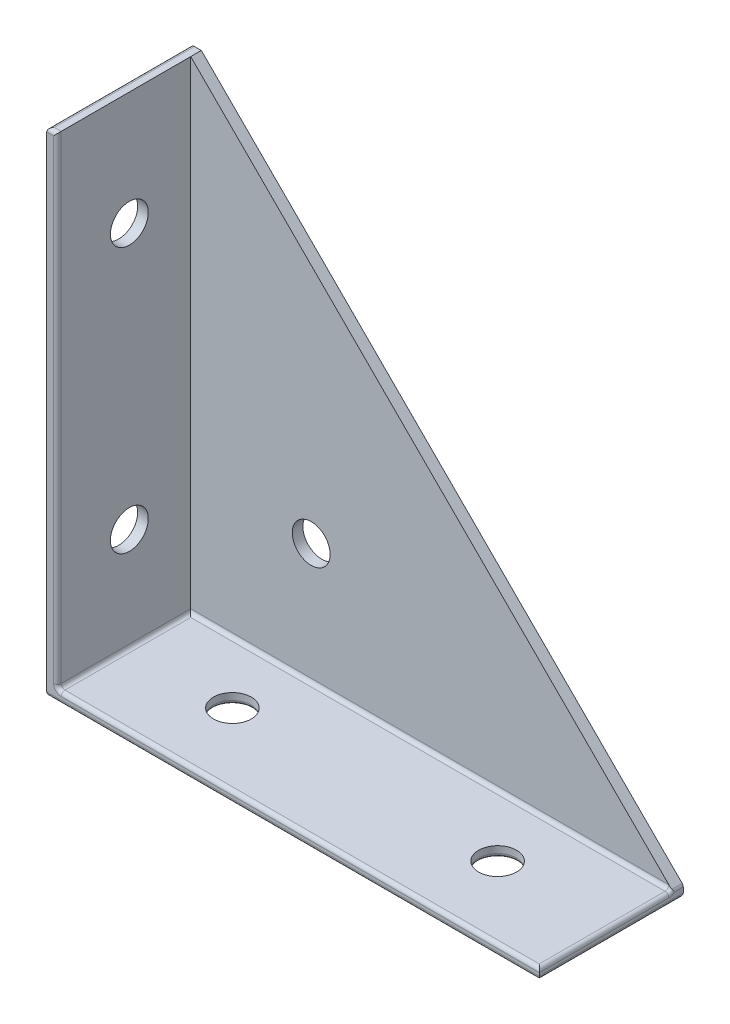
ISO-10303-21;
HEADER;
FILE_DESCRIPTION(('STEP AP214'),'2;1');
FILE_NAME('part.step','',(''),(''),'','','');
FILE_SCHEMA(('AUTOMOTIVE_DESIGN { 1 0 10303 214 1 1 1 1 }'));
ENDSEC;
DATA;
#1=APPLICATION_CONTEXT('core data for automotive mechanical design processes');
#2=APPLICATION_PROTOCOL_DEFINITION('international standard','automotive_design',2000,#1);
#3=PRODUCT_CONTEXT('',#1,'mechanical');
#4=PRODUCT('Part','Part','',(#3));
#5=PRODUCT_RELATED_PRODUCT_CATEGORY('part','',(#4));
#6=PRODUCT_DEFINITION_FORMATION('','',#4);
#7=PRODUCT_DEFINITION_CONTEXT('part definition',#1,'design');
#8=PRODUCT_DEFINITION('design','',#6,#7);
#9=PRODUCT_DEFINITION_SHAPE('','',#8);
#10=(LENGTH_UNIT() NAMED_UNIT(*) SI_UNIT(.MILLI.,.METRE.));
#11=(NAMED_UNIT(*) PLANE_ANGLE_UNIT() SI_UNIT($,.RADIAN.));
#12=(NAMED_UNIT(*) SI_UNIT($,.STERADIAN.) SOLID_ANGLE_UNIT());
#13=UNCERTAINTY_MEASURE_WITH_UNIT(LENGTH_MEASURE(1.E-05),#10,'distance_accuracy_value','');
#14=(GEOMETRIC_REPRESENTATION_CONTEXT(3) GLOBAL_UNCERTAINTY_ASSIGNED_CONTEXT((#13)) GLOBAL_UNIT_ASSIGNED_CONTEXT((#10,
#11,#12)) REPRESENTATION_CONTEXT('',''));
#15=CARTESIAN_POINT('',(0.,0.,0.));
#16=DIRECTION('',(0.,0.,1.));
#17=DIRECTION('',(1.,0.,0.));
#18=AXIS2_PLACEMENT_3D('',#15,#16,#17);
#19=CARTESIAN_POINT('',(0.,0.7,19.));
#20=DIRECTION('',(0.,-1.,0.));
#21=DIRECTION('',(1.,0.,0.));
#22=AXIS2_PLACEMENT_3D('',#19,#20,#21);
#23=PLANE('',#22);
#24=DIRECTION('',(-1.,0.,0.));
#25=VECTOR('',#24,1.);
#26=CARTESIAN_POINT('',(0.,0.7,18.5));
#27=LINE('',#26,#25);
#28=CARTESIAN_POINT('',(-63.1,0.699999999999992,18.5));
#29=VERTEX_POINT('',#28);
#30=CARTESIAN_POINT('',(-0.5,0.7,18.5));
#31=VERTEX_POINT('',#30);
#32=EDGE_CURVE('E297',#29,#31,#27,.F.);
#33=ORIENTED_EDGE('',*,*,#32,.T.);
#34=DIRECTION('',(0.,0.,-1.));
#35=VECTOR('',#34,1.);
#36=CARTESIAN_POINT('',(-0.5,0.7,19.));
#37=LINE('',#36,#35);
#38=CARTESIAN_POINT('',(-0.5,0.7,1.9));
#39=VERTEX_POINT('',#38);
#40=EDGE_CURVE('E299',#31,#39,#37,.T.);
#41=ORIENTED_EDGE('',*,*,#40,.T.);
#42=DIRECTION('',(-1.,0.,0.));
#43=VECTOR('',#42,1.);
#44=CARTESIAN_POINT('',(-63.6,0.699999999999992,1.9));
#45=LINE('',#44,#43);
#46=CARTESIAN_POINT('',(-63.1,0.699999999999992,1.9));
#47=VERTEX_POINT('',#46);
#48=EDGE_CURVE('E287',#39,#47,#45,.T.);
#49=ORIENTED_EDGE('',*,*,#48,.T.);
#50=DIRECTION('',(0.,0.,-1.));
#51=VECTOR('',#50,1.);
#52=CARTESIAN_POINT('',(-63.1,0.699999999999992,19.));
#53=LINE('',#52,#51);
#54=EDGE_CURVE('E290',#47,#29,#53,.F.);
#55=ORIENTED_EDGE('',*,*,#54,.T.);
#56=EDGE_LOOP('',(#33,#41,#49,#55));
#57=FACE_BOUND('',#56,.T.);
#58=CARTESIAN_POINT('',(-15.,0.700000000000006,9.50000000000001));
#59=DIRECTION('',(0.,-1.,0.));
#60=DIRECTION('',(1.,0.,0.));
#61=AXIS2_PLACEMENT_3D('',#58,#59,#60);
#62=CIRCLE('',#61,2.5);
#63=CARTESIAN_POINT('',(-12.5,0.700000000000007,9.50000000000001));
#64=VERTEX_POINT('',#63);
#65=EDGE_CURVE('E173',#64,#64,#62,.T.);
#66=ORIENTED_EDGE('',*,*,#65,.T.);
#67=EDGE_LOOP('',(#66));
#68=FACE_BOUND('',#67,.T.);
#69=CARTESIAN_POINT('',(-50.,0.700000000000006,9.5));
#70=DIRECTION('',(0.,-1.,0.));
#71=DIRECTION('',(1.,0.,0.));
#72=AXIS2_PLACEMENT_3D('',#69,#70,#71);
#73=CIRCLE('',#72,2.5);
#74=CARTESIAN_POINT('',(-47.5,0.700000000000007,9.5));
#75=VERTEX_POINT('',#74);
#76=EDGE_CURVE('E177',#75,#75,#73,.T.);
#77=ORIENTED_EDGE('',*,*,#76,.T.);
#78=EDGE_LOOP('',(#77));
#79=FACE_BOUND('',#78,.T.);
#80=ADVANCED_FACE('F35',(#57,#68,#79),#23,.F.);
#81=CARTESIAN_POINT('',(-63.6,0.699999999999992,19.));
#82=DIRECTION('',(-1.,0.,0.));
#83=DIRECTION('',(0.,0.,1.));
#84=AXIS2_PLACEMENT_3D('',#81,#82,#83);
#85=PLANE('',#84);
#86=CARTESIAN_POINT('',(-63.6,49.3,9.50000000000001));
#87=DIRECTION('',(-1.,0.,0.));
#88=DIRECTION('',(0.,0.,1.));
#89=AXIS2_PLACEMENT_3D('',#86,#87,#88);
#90=CIRCLE('',#89,2.5);
#91=CARTESIAN_POINT('',(-63.6,49.3,12.));
#92=VERTEX_POINT('',#91);
#93=EDGE_CURVE('E433',#92,#92,#90,.F.);
#94=ORIENTED_EDGE('',*,*,#93,.F.);
#95=EDGE_LOOP('',(#94));
#96=FACE_BOUND('',#95,.T.);
#97=CARTESIAN_POINT('',(-63.6,14.3,9.5));
#98=DIRECTION('',(-1.,0.,0.));
#99=DIRECTION('',(0.,0.,1.));
#100=AXIS2_PLACEMENT_3D('',#97,#98,#99);
#101=CIRCLE('',#100,2.5);
#102=CARTESIAN_POINT('',(-63.6,14.3,12.));
#103=VERTEX_POINT('',#102);
#104=EDGE_CURVE('E436',#103,#103,#101,.F.);
#105=ORIENTED_EDGE('',*,*,#104,.F.);
#106=EDGE_LOOP('',(#105));
#107=FACE_BOUND('',#106,.T.);
#108=DIRECTION('',(0.,0.,-1.));
#109=VECTOR('',#108,1.);
#110=CARTESIAN_POINT('',(-63.6,64.3,19.));
#111=LINE('',#110,#109);
#112=CARTESIAN_POINT('',(-63.6,64.3,18.5));
#113=VERTEX_POINT('',#112);
#114=CARTESIAN_POINT('',(-63.6,64.3,1.4));
#115=VERTEX_POINT('',#114);
#116=EDGE_CURVE('E162',#113,#115,#111,.T.);
#117=ORIENTED_EDGE('',*,*,#116,.F.);
#118=DIRECTION('',(0.,1.,0.));
#119=VECTOR('',#118,1.);
#120=CARTESIAN_POINT('',(-63.6,0.699999999999992,18.5));
#121=LINE('',#120,#119);
#122=CARTESIAN_POINT('',(-63.6,1.19999999999999,18.5));
#123=VERTEX_POINT('',#122);
#124=EDGE_CURVE('E206',#113,#123,#121,.F.);
#125=ORIENTED_EDGE('',*,*,#124,.T.);
#126=DIRECTION('',(0.,0.,-1.));
#127=VECTOR('',#126,1.);
#128=CARTESIAN_POINT('',(-63.6,1.19999999999999,1.4));
#129=LINE('',#128,#127);
#130=CARTESIAN_POINT('',(-63.6,1.19999999999999,1.4));
#131=VERTEX_POINT('',#130);
#132=EDGE_CURVE('E204',#123,#131,#129,.T.);
#133=ORIENTED_EDGE('',*,*,#132,.T.);
#134=DIRECTION('',(0.,1.,0.));
#135=VECTOR('',#134,1.);
#136=CARTESIAN_POINT('',(-63.6,64.3,1.4));
#137=LINE('',#136,#135);
#138=EDGE_CURVE('E172',#131,#115,#137,.T.);
#139=ORIENTED_EDGE('',*,*,#138,.T.);
#140=EDGE_LOOP('',(#117,#125,#133,#139));
#141=FACE_BOUND('',#140,.T.);
#142=ADVANCED_FACE('F257',(#96,#107,#141),#85,.F.);
#143=CARTESIAN_POINT('',(0.,0.7,19.));
#144=DIRECTION('',(-1.,0.,0.));
#145=DIRECTION('',(0.,0.,1.));
#146=AXIS2_PLACEMENT_3D('',#143,#144,#145);
#147=PLANE('',#146);
#148=DIRECTION('',(0.,1.,0.));
#149=VECTOR('',#148,1.);
#150=CARTESIAN_POINT('',(0.,0.7,0.));
#151=LINE('',#150,#149);
#152=CARTESIAN_POINT('',(0.,-0.2,0.));
#153=VERTEX_POINT('',#152);
#154=CARTESIAN_POINT('',(0.,0.492893218813452,0.));
#155=VERTEX_POINT('',#154);
#156=EDGE_CURVE('E156',#153,#155,#151,.T.);
#157=ORIENTED_EDGE('',*,*,#156,.T.);
#158=DIRECTION('',(0.,0.,-1.));
#159=VECTOR('',#158,1.);
#160=CARTESIAN_POINT('',(0.,0.492893218813452,1.9));
#161=LINE('',#160,#159);
#162=CARTESIAN_POINT('',(0.,0.492893218813452,1.19289321881345));
#163=VERTEX_POINT('',#162);
#164=EDGE_CURVE('E276',#155,#163,#161,.F.);
#165=ORIENTED_EDGE('',*,*,#164,.T.);
#166=CARTESIAN_POINT('',(0.,1.2,1.9));
#167=DIRECTION('',(-1.,0.,0.));
#168=DIRECTION('',(0.,0.,1.));
#169=AXIS2_PLACEMENT_3D('',#166,#167,#168);
#170=CIRCLE('',#169,1.);
#171=CARTESIAN_POINT('',(0.,0.2,1.9));
#172=VERTEX_POINT('',#171);
#173=EDGE_CURVE('E288',#163,#172,#170,.T.);
#174=ORIENTED_EDGE('',*,*,#173,.T.);
#175=DIRECTION('',(0.,0.,-1.));
#176=VECTOR('',#175,1.);
#177=CARTESIAN_POINT('',(0.,0.2,19.));
#178=LINE('',#177,#176);
#179=CARTESIAN_POINT('',(0.,0.2,19.));
#180=VERTEX_POINT('',#179);
#181=EDGE_CURVE('E292',#172,#180,#178,.F.);
#182=ORIENTED_EDGE('',*,*,#181,.T.);
#183=DIRECTION('',(0.,1.,0.));
#184=VECTOR('',#183,1.);
#185=CARTESIAN_POINT('',(0.,0.7,19.));
#186=LINE('',#185,#184);
#187=CARTESIAN_POINT('',(0.,-0.2,19.));
#188=VERTEX_POINT('',#187);
#189=EDGE_CURVE('E181',#188,#180,#186,.T.);
#190=ORIENTED_EDGE('',*,*,#189,.F.);
#191=DIRECTION('',(0.,0.,-1.));
#192=VECTOR('',#191,1.);
#193=CARTESIAN_POINT('',(0.,-0.2,19.));
#194=LINE('',#193,#192);
#195=EDGE_CURVE('E280',#188,#153,#194,.T.);
#196=ORIENTED_EDGE('',*,*,#195,.T.);
#197=EDGE_LOOP('',(#157,#165,#174,#182,#190,#196));
#198=FACE_BOUND('',#197,.T.);
#199=ADVANCED_FACE('F263',(#198),#147,.F.);
#200=CARTESIAN_POINT('',(-65.,64.3,19.));
#201=DIRECTION('',(0.,-1.,0.));
#202=DIRECTION('',(0.,0.,-1.));
#203=AXIS2_PLACEMENT_3D('',#200,#201,#202);
#204=PLANE('',#203);
#205=DIRECTION('',(0.,0.,-1.));
#206=VECTOR('',#205,1.);
#207=CARTESIAN_POINT('',(-64.5,64.3,19.));
#208=LINE('',#207,#206);
#209=CARTESIAN_POINT('',(-64.5,64.3,0.));
#210=VERTEX_POINT('',#209);
#211=CARTESIAN_POINT('',(-64.5,64.3,18.5));
#212=VERTEX_POINT('',#211);
#213=EDGE_CURVE('E44',#210,#212,#208,.F.);
#214=ORIENTED_EDGE('',*,*,#213,.T.);
#215=DIRECTION('',(-1.,0.,0.));
#216=VECTOR('',#215,1.);
#217=CARTESIAN_POINT('',(-65.,64.3,18.5));
#218=LINE('',#217,#216);
#219=EDGE_CURVE('E11',#212,#113,#218,.F.);
#220=ORIENTED_EDGE('',*,*,#219,.T.);
#221=ORIENTED_EDGE('',*,*,#116,.T.);
#222=DIRECTION('',(0.,0.,-1.));
#223=VECTOR('',#222,1.);
#224=CARTESIAN_POINT('',(-63.6,64.3,1.4));
#225=LINE('',#224,#223);
#226=CARTESIAN_POINT('',(-63.6,64.3,0.));
#227=VERTEX_POINT('',#226);
#228=EDGE_CURVE('E159',#115,#227,#225,.T.);
#229=ORIENTED_EDGE('',*,*,#228,.T.);
#230=DIRECTION('',(-1.,0.,0.));
#231=VECTOR('',#230,1.);
#232=CARTESIAN_POINT('',(-65.,64.3,0.));
#233=LINE('',#232,#231);
#234=EDGE_CURVE('E146',#227,#210,#233,.T.);
#235=ORIENTED_EDGE('',*,*,#234,.T.);
#236=EDGE_LOOP('',(#214,#220,#221,#229,#235));
#237=FACE_BOUND('',#236,.T.);
#238=ADVANCED_FACE('F160',(#237),#204,.F.);
#239=CARTESIAN_POINT('',(-65.,-0.700000000000008,19.));
#240=DIRECTION('',(1.,0.,0.));
#241=DIRECTION('',(0.,0.,-1.));
#242=AXIS2_PLACEMENT_3D('',#239,#240,#241);
#243=PLANE('',#242);
#244=CARTESIAN_POINT('',(-65.,49.3,9.50000000000001));
#245=DIRECTION('',(1.,0.,0.));
#246=DIRECTION('',(0.,1.,0.));
#247=AXIS2_PLACEMENT_3D('',#244,#245,#246);
#248=CIRCLE('',#247,2.5);
#249=CARTESIAN_POINT('',(-65.,51.8,9.50000000000001));
#250=VERTEX_POINT('',#249);
#251=EDGE_CURVE('E441',#250,#250,#248,.T.);
#252=ORIENTED_EDGE('',*,*,#251,.T.);
#253=EDGE_LOOP('',(#252));
#254=FACE_BOUND('',#253,.T.);
#255=CARTESIAN_POINT('',(-65.,14.3,9.5));
#256=DIRECTION('',(1.,0.,0.));
#257=DIRECTION('',(0.,1.,0.));
#258=AXIS2_PLACEMENT_3D('',#255,#256,#257);
#259=CIRCLE('',#258,2.5);
#260=CARTESIAN_POINT('',(-65.,16.8,9.5));
#261=VERTEX_POINT('',#260);
#262=EDGE_CURVE('E489',#261,#261,#259,.T.);
#263=ORIENTED_EDGE('',*,*,#262,.T.);
#264=EDGE_LOOP('',(#263));
#265=FACE_BOUND('',#264,.T.);
#266=DIRECTION('',(0.,-1.,0.));
#267=VECTOR('',#266,1.);
#268=CARTESIAN_POINT('',(-65.,-0.700000000000008,0.));
#269=LINE('',#268,#267);
#270=CARTESIAN_POINT('',(-65.,63.8,0.));
#271=VERTEX_POINT('',#270);
#272=CARTESIAN_POINT('',(-65.,-0.200000000000008,0.));
#273=VERTEX_POINT('',#272);
#274=EDGE_CURVE('E155',#271,#273,#269,.T.);
#275=ORIENTED_EDGE('',*,*,#274,.T.);
#276=DIRECTION('',(0.,0.,-1.));
#277=VECTOR('',#276,1.);
#278=CARTESIAN_POINT('',(-65.,-0.200000000000008,19.));
#279=LINE('',#278,#277);
#280=CARTESIAN_POINT('',(-65.,-0.200000000000008,19.));
#281=VERTEX_POINT('',#280);
#282=EDGE_CURVE('E319',#273,#281,#279,.F.);
#283=ORIENTED_EDGE('',*,*,#282,.T.);
#284=DIRECTION('',(0.,-1.,0.));
#285=VECTOR('',#284,1.);
#286=CARTESIAN_POINT('',(-65.,-0.700000000000008,19.));
#287=LINE('',#286,#285);
#288=CARTESIAN_POINT('',(-65.,63.8,19.));
#289=VERTEX_POINT('',#288);
#290=EDGE_CURVE('E184',#289,#281,#287,.T.);
#291=ORIENTED_EDGE('',*,*,#290,.F.);
#292=DIRECTION('',(0.,0.,-1.));
#293=VECTOR('',#292,1.);
#294=CARTESIAN_POINT('',(-65.,63.8,19.));
#295=LINE('',#294,#293);
#296=EDGE_CURVE('E317',#289,#271,#295,.T.);
#297=ORIENTED_EDGE('',*,*,#296,.T.);
#298=EDGE_LOOP('',(#275,#283,#291,#297));
#299=FACE_BOUND('',#298,.T.);
#300=ADVANCED_FACE('F273',(#254,#265,#299),#243,.F.);
#301=CARTESIAN_POINT('',(0.,-0.7,19.));
#302=DIRECTION('',(0.,1.,0.));
#303=DIRECTION('',(-1.,0.,0.));
#304=AXIS2_PLACEMENT_3D('',#301,#302,#303);
#305=PLANE('',#304);
#306=DIRECTION('',(1.,0.,0.));
#307=VECTOR('',#306,1.);
#308=CARTESIAN_POINT('',(0.,-0.7,18.5));
#309=LINE('',#308,#307);
#310=CARTESIAN_POINT('',(-0.5,-0.7,18.5));
#311=VERTEX_POINT('',#310);
#312=CARTESIAN_POINT('',(-64.5,-0.700000000000008,18.5));
#313=VERTEX_POINT('',#312);
#314=EDGE_CURVE('E58',#311,#313,#309,.F.);
#315=ORIENTED_EDGE('',*,*,#314,.T.);
#316=DIRECTION('',(0.,0.,-1.));
#317=VECTOR('',#316,1.);
#318=CARTESIAN_POINT('',(-64.5,-0.700000000000008,19.));
#319=LINE('',#318,#317);
#320=CARTESIAN_POINT('',(-64.5,-0.700000000000008,0.5));
#321=VERTEX_POINT('',#320);
#322=EDGE_CURVE('E315',#313,#321,#319,.T.);
#323=ORIENTED_EDGE('',*,*,#322,.T.);
#324=DIRECTION('',(1.,0.,0.));
#325=VECTOR('',#324,1.);
#326=CARTESIAN_POINT('',(0.,-0.7,0.5));
#327=LINE('',#326,#325);
#328=CARTESIAN_POINT('',(-0.5,-0.7,0.5));
#329=VERTEX_POINT('',#328);
#330=EDGE_CURVE('E310',#321,#329,#327,.T.);
#331=ORIENTED_EDGE('',*,*,#330,.T.);
#332=DIRECTION('',(0.,0.,-1.));
#333=VECTOR('',#332,1.);
#334=CARTESIAN_POINT('',(-0.5,-0.7,19.));
#335=LINE('',#334,#333);
#336=EDGE_CURVE('E312',#329,#311,#335,.F.);
#337=ORIENTED_EDGE('',*,*,#336,.T.);
#338=EDGE_LOOP('',(#315,#323,#331,#337));
#339=FACE_BOUND('',#338,.T.);
#340=CARTESIAN_POINT('',(-50.,-0.700000000000006,9.5));
#341=DIRECTION('',(0.,1.,0.));
#342=DIRECTION('',(-1.,0.,0.));
#343=AXIS2_PLACEMENT_3D('',#340,#341,#342);
#344=CIRCLE('',#343,3.);
#345=CARTESIAN_POINT('',(-53.,-0.700000000000006,9.5));
#346=VERTEX_POINT('',#345);
#347=EDGE_CURVE('E307',#346,#346,#344,.T.);
#348=ORIENTED_EDGE('',*,*,#347,.T.);
#349=EDGE_LOOP('',(#348));
#350=FACE_BOUND('',#349,.T.);
#351=CARTESIAN_POINT('',(-15.,-0.700000000000002,9.50000000000001));
#352=DIRECTION('',(0.,1.,0.));
#353=DIRECTION('',(-1.,0.,0.));
#354=AXIS2_PLACEMENT_3D('',#351,#352,#353);
#355=CIRCLE('',#354,3.);
#356=CARTESIAN_POINT('',(-18.,-0.700000000000002,9.50000000000001));
#357=VERTEX_POINT('',#356);
#358=EDGE_CURVE('E304',#357,#357,#355,.T.);
#359=ORIENTED_EDGE('',*,*,#358,.T.);
#360=EDGE_LOOP('',(#359));
#361=FACE_BOUND('',#360,.T.);
#362=ADVANCED_FACE('F473',(#339,#350,#361),#305,.F.);
#363=CARTESIAN_POINT('',(0.,0.,19.));
#364=DIRECTION('',(0.,0.,-1.));
#365=DIRECTION('',(-1.,0.,0.));
#366=AXIS2_PLACEMENT_3D('',#363,#364,#365);
#367=PLANE('',#366);
#368=ORIENTED_EDGE('',*,*,#290,.T.);
#369=DIRECTION('',(1.,0.,0.));
#370=VECTOR('',#369,1.);
#371=CARTESIAN_POINT('',(0.,-0.2,19.));
#372=LINE('',#371,#370);
#373=EDGE_CURVE('E202',#281,#188,#372,.T.);
#374=ORIENTED_EDGE('',*,*,#373,.T.);
#375=ORIENTED_EDGE('',*,*,#189,.T.);
#376=DIRECTION('',(-1.,0.,0.));
#377=VECTOR('',#376,1.);
#378=CARTESIAN_POINT('',(0.,0.2,19.));
#379=LINE('',#378,#377);
#380=CARTESIAN_POINT('',(-63.1,0.199999999999992,19.));
#381=VERTEX_POINT('',#380);
#382=EDGE_CURVE('E200',#180,#381,#379,.T.);
#383=ORIENTED_EDGE('',*,*,#382,.T.);
#384=CARTESIAN_POINT('',(-63.1,1.19999999999999,19.));
#385=DIRECTION('',(0.,0.,-1.));
#386=DIRECTION('',(-1.,0.,0.));
#387=AXIS2_PLACEMENT_3D('',#384,#385,#386);
#388=CIRCLE('',#387,1.);
#389=CARTESIAN_POINT('',(-64.1,1.19999999999999,19.));
#390=VERTEX_POINT('',#389);
#391=EDGE_CURVE('E197',#390,#381,#388,.F.);
#392=ORIENTED_EDGE('',*,*,#391,.F.);
#393=DIRECTION('',(0.,1.,0.));
#394=VECTOR('',#393,1.);
#395=CARTESIAN_POINT('',(-64.1,0.,19.));
#396=LINE('',#395,#394);
#397=CARTESIAN_POINT('',(-64.1,63.8,19.));
#398=VERTEX_POINT('',#397);
#399=EDGE_CURVE('E194',#390,#398,#396,.T.);
#400=ORIENTED_EDGE('',*,*,#399,.T.);
#401=DIRECTION('',(-1.,0.,0.));
#402=VECTOR('',#401,1.);
#403=CARTESIAN_POINT('',(0.,63.8,19.));
#404=LINE('',#403,#402);
#405=EDGE_CURVE('E192',#398,#289,#404,.T.);
#406=ORIENTED_EDGE('',*,*,#405,.T.);
#407=EDGE_LOOP('',(#368,#374,#375,#383,#392,#400,#406));
#408=FACE_BOUND('',#407,.T.);
#409=ADVANCED_FACE('F420',(#408),#367,.F.);
#410=CARTESIAN_POINT('',(0.,0.,0.));
#411=DIRECTION('',(0.,0.,-1.));
#412=DIRECTION('',(-1.,0.,0.));
#413=AXIS2_PLACEMENT_3D('',#410,#411,#412);
#414=PLANE('',#413);
#415=CARTESIAN_POINT('',(-47.7,16.6,0.));
#416=DIRECTION('',(0.,0.,1.));
#417=DIRECTION('',(1.,0.,0.));
#418=AXIS2_PLACEMENT_3D('',#415,#416,#417);
#419=CIRCLE('',#418,2.5);
#420=CARTESIAN_POINT('',(-45.2,16.6,0.));
#421=VERTEX_POINT('',#420);
#422=EDGE_CURVE('E445',#421,#421,#419,.T.);
#423=ORIENTED_EDGE('',*,*,#422,.T.);
#424=EDGE_LOOP('',(#423));
#425=FACE_BOUND('',#424,.T.);
#426=DIRECTION('',(0.707106781186548,-0.707106781186547,0.));
#427=VECTOR('',#426,1.);
#428=CARTESIAN_POINT('',(0.,0.7,0.));
#429=LINE('',#428,#427);
#430=CARTESIAN_POINT('',(-0.146446609406726,0.846446609406726,0.));
#431=VERTEX_POINT('',#430);
#432=EDGE_CURVE('E150',#227,#431,#429,.T.);
#433=ORIENTED_EDGE('',*,*,#432,.T.);
#434=CARTESIAN_POINT('',(-0.5,0.492893218813452,0.));
#435=DIRECTION('',(0.,0.,-1.));
#436=DIRECTION('',(-1.,0.,0.));
#437=AXIS2_PLACEMENT_3D('',#434,#435,#436);
#438=CIRCLE('',#437,0.5);
#439=EDGE_CURVE('E283',#431,#155,#438,.T.);
#440=ORIENTED_EDGE('',*,*,#439,.T.);
#441=ORIENTED_EDGE('',*,*,#156,.F.);
#442=DIRECTION('',(1.,0.,0.));
#443=VECTOR('',#442,1.);
#444=CARTESIAN_POINT('',(-65.,-0.200000000000008,0.));
#445=LINE('',#444,#443);
#446=EDGE_CURVE('E492',#153,#273,#445,.F.);
#447=ORIENTED_EDGE('',*,*,#446,.T.);
#448=ORIENTED_EDGE('',*,*,#274,.F.);
#449=CARTESIAN_POINT('',(-64.5,63.8,0.));
#450=DIRECTION('',(0.,0.,-1.));
#451=DIRECTION('',(-1.,0.,0.));
#452=AXIS2_PLACEMENT_3D('',#449,#450,#451);
#453=CIRCLE('',#452,0.5);
#454=EDGE_CURVE('E154',#271,#210,#453,.T.);
#455=ORIENTED_EDGE('',*,*,#454,.T.);
#456=ORIENTED_EDGE('',*,*,#234,.F.);
#457=EDGE_LOOP('',(#433,#440,#441,#447,#448,#455,#456));
#458=FACE_BOUND('',#457,.T.);
#459=ADVANCED_FACE('F148',(#425,#458),#414,.T.);
#460=CARTESIAN_POINT('',(0.,0.7,1.4));
#461=DIRECTION('',(0.707106781186547,0.707106781186548,0.));
#462=DIRECTION('',(-0.707106781186548,0.707106781186547,0.));
#463=AXIS2_PLACEMENT_3D('',#460,#461,#462);
#464=PLANE('',#463);
#465=CARTESIAN_POINT('',(-0.5,1.2,1.4));
#466=CARTESIAN_POINT('',(-0.485162219203026,1.18516221920303,1.39999377626002));
#467=CARTESIAN_POINT('',(-0.470325305604055,1.17032530560406,1.40000226844239));
#468=CARTESIAN_POINT('',(-0.440660384887088,1.14066038488709,1.39998197331207));
#469=CARTESIAN_POINT('',(-0.425832377753319,1.12583237775332,1.3999532083087));
#470=CARTESIAN_POINT('',(-0.381507333883705,1.0815073338837,1.39971203403552));
#471=CARTESIAN_POINT('',(-0.352007815647787,1.05200781564779,1.39934612237822));
#472=CARTESIAN_POINT('',(-0.307669988459025,1.00766998845903,1.39714807314896));
#473=CARTESIAN_POINT('',(-0.29281604580657,0.99281604580657,1.3961330750389));
#474=CARTESIAN_POINT('',(-0.263181929372075,0.963181929372075,1.39311409571184));
#475=CARTESIAN_POINT('',(-0.248401672146648,0.948401672146648,1.3911118409812));
#476=CARTESIAN_POINT('',(-0.218879854060639,0.918879854060639,1.38553486882269));
#477=CARTESIAN_POINT('',(-0.204139021061337,0.904139021061337,1.38195105274939));
#478=CARTESIAN_POINT('',(-0.174965433460443,0.874965433460443,1.37238920837349));
#479=CARTESIAN_POINT('',(-0.16053519863333,0.86053519863333,1.36639626819988));
#480=CARTESIAN_POINT('',(-0.146446609406726,0.846446609406726,1.3588038998538));
#481=B_SPLINE_CURVE_WITH_KNOTS('',3,(#465,#466,#467,#468,#469,#470,#471,#472,#473,#474,#475,
#476,#477,#478,#479,#480),.UNSPECIFIED.,.F.,.F.,(4,2,2,2,2,2,2,4),(0.,0.0629489015635165,
0.125860127208308,0.250997435552492,0.314075444483414,0.37704353353592,0.440378695750531,
0.504112076163589),.UNSPECIFIED.);
#482=CARTESIAN_POINT('',(-0.5,1.2,1.4));
#483=VERTEX_POINT('',#482);
#484=CARTESIAN_POINT('',(-0.146446609406726,0.846446609406726,1.3588038998538));
#485=VERTEX_POINT('',#484);
#486=EDGE_CURVE('E208',#483,#485,#481,.T.);
#487=ORIENTED_EDGE('',*,*,#486,.T.);
#488=DIRECTION('',(0.,0.,-1.));
#489=VECTOR('',#488,1.);
#490=CARTESIAN_POINT('',(-0.146446609406726,0.846446609406726,0.));
#491=LINE('',#490,#489);
#492=EDGE_CURVE('E171',#485,#431,#491,.T.);
#493=ORIENTED_EDGE('',*,*,#492,.T.);
#494=ORIENTED_EDGE('',*,*,#432,.F.);
#495=ORIENTED_EDGE('',*,*,#228,.F.);
#496=DIRECTION('',(0.707106781186548,-0.707106781186547,0.));
#497=VECTOR('',#496,1.);
#498=CARTESIAN_POINT('',(0.,0.7,1.4));
#499=LINE('',#498,#497);
#500=EDGE_CURVE('E167',#115,#483,#499,.T.);
#501=ORIENTED_EDGE('',*,*,#500,.T.);
#502=EDGE_LOOP('',(#487,#493,#494,#495,#501));
#503=FACE_BOUND('',#502,.T.);
#504=ADVANCED_FACE('F169',(#503),#464,.T.);
#505=CARTESIAN_POINT('',(0.,0.,1.4));
#506=DIRECTION('',(0.,0.,-1.));
#507=DIRECTION('',(-1.,0.,0.));
#508=AXIS2_PLACEMENT_3D('',#505,#506,#507);
#509=PLANE('',#508);
#510=CARTESIAN_POINT('',(-47.7,16.6,1.4));
#511=DIRECTION('',(0.,0.,1.));
#512=DIRECTION('',(1.,0.,0.));
#513=AXIS2_PLACEMENT_3D('',#510,#511,#512);
#514=CIRCLE('',#513,2.5);
#515=CARTESIAN_POINT('',(-45.2,16.6,1.4));
#516=VERTEX_POINT('',#515);
#517=EDGE_CURVE('E360',#516,#516,#514,.T.);
#518=ORIENTED_EDGE('',*,*,#517,.F.);
#519=EDGE_LOOP('',(#518));
#520=FACE_BOUND('',#519,.T.);
#521=ORIENTED_EDGE('',*,*,#138,.F.);
#522=DIRECTION('',(-1.,0.,0.));
#523=VECTOR('',#522,1.);
#524=CARTESIAN_POINT('',(0.,1.2,1.4));
#525=LINE('',#524,#523);
#526=EDGE_CURVE('E302',#131,#483,#525,.F.);
#527=ORIENTED_EDGE('',*,*,#526,.T.);
#528=ORIENTED_EDGE('',*,*,#500,.F.);
#529=EDGE_LOOP('',(#521,#527,#528));
#530=FACE_BOUND('',#529,.T.);
#531=ADVANCED_FACE('F410',(#520,#530),#509,.F.);
#532=CARTESIAN_POINT('',(-50.,64.3,9.5));
#533=DIRECTION('',(0.,-1.,0.));
#534=DIRECTION('',(1.,0.,0.));
#535=AXIS2_PLACEMENT_3D('',#532,#533,#534);
#536=CYLINDRICAL_SURFACE('',#535,2.5);
#537=CARTESIAN_POINT('',(-50.,-0.200000000000006,9.5));
#538=DIRECTION('',(0.,1.,0.));
#539=DIRECTION('',(-1.,0.,0.));
#540=AXIS2_PLACEMENT_3D('',#537,#538,#539);
#541=CIRCLE('',#540,2.5);
#542=CARTESIAN_POINT('',(-52.5,-0.200000000000006,9.5));
#543=VERTEX_POINT('',#542);
#544=EDGE_CURVE('E322',#543,#543,#541,.F.);
#545=ORIENTED_EDGE('',*,*,#544,.T.);
#546=EDGE_LOOP('',(#545));
#547=FACE_BOUND('',#546,.T.);
#548=ORIENTED_EDGE('',*,*,#76,.F.);
#549=EDGE_LOOP('',(#548));
#550=FACE_BOUND('',#549,.T.);
#551=ADVANCED_FACE('F454',(#547,#550),#536,.F.);
#552=CARTESIAN_POINT('',(-15.,64.3,9.50000000000001));
#553=DIRECTION('',(0.,-1.,0.));
#554=DIRECTION('',(1.,0.,0.));
#555=AXIS2_PLACEMENT_3D('',#552,#553,#554);
#556=CYLINDRICAL_SURFACE('',#555,2.5);
#557=CARTESIAN_POINT('',(-15.,-0.200000000000006,9.50000000000001));
#558=DIRECTION('',(0.,1.,0.));
#559=DIRECTION('',(-1.,0.,0.));
#560=AXIS2_PLACEMENT_3D('',#557,#558,#559);
#561=CIRCLE('',#560,2.5);
#562=CARTESIAN_POINT('',(-17.5,-0.200000000000006,9.50000000000001));
#563=VERTEX_POINT('',#562);
#564=EDGE_CURVE('E325',#563,#563,#561,.F.);
#565=ORIENTED_EDGE('',*,*,#564,.T.);
#566=EDGE_LOOP('',(#565));
#567=FACE_BOUND('',#566,.T.);
#568=ORIENTED_EDGE('',*,*,#65,.F.);
#569=EDGE_LOOP('',(#568));
#570=FACE_BOUND('',#569,.T.);
#571=ADVANCED_FACE('F456',(#567,#570),#556,.F.);
#572=CARTESIAN_POINT('',(-47.7,16.6,0.));
#573=DIRECTION('',(0.,0.,1.));
#574=DIRECTION('',(1.,0.,0.));
#575=AXIS2_PLACEMENT_3D('',#572,#573,#574);
#576=CYLINDRICAL_SURFACE('',#575,2.5);
#577=ORIENTED_EDGE('',*,*,#422,.F.);
#578=EDGE_LOOP('',(#577));
#579=FACE_BOUND('',#578,.T.);
#580=ORIENTED_EDGE('',*,*,#517,.T.);
#581=EDGE_LOOP('',(#580));
#582=FACE_BOUND('',#581,.T.);
#583=ADVANCED_FACE('F366',(#579,#582),#576,.F.);
#584=CARTESIAN_POINT('',(-0.5,0.492893218813452,1.4));
#585=DIRECTION('',(0.,0.,1.));
#586=DIRECTION('',(1.,0.,0.));
#587=AXIS2_PLACEMENT_3D('',#584,#585,#586);
#588=CYLINDRICAL_SURFACE('',#587,0.5);
#589=ORIENTED_EDGE('',*,*,#439,.F.);
#590=ORIENTED_EDGE('',*,*,#492,.F.);
#591=CARTESIAN_POINT('',(-0.146446609406726,0.846446609406726,1.3588038998538));
#592=CARTESIAN_POINT('',(-0.124784367461786,0.824794291418535,1.34706290394334));
#593=CARTESIAN_POINT('',(-0.105297161182896,0.801320312395509,1.3347620776401));
#594=CARTESIAN_POINT('',(-0.070963407803651,0.751434681820469,1.30948924996582));
#595=CARTESIAN_POINT('',(-0.0561252167792954,0.725017855010009,1.29651608835444));
#596=CARTESIAN_POINT('',(-0.0314661332416588,0.670048993151626,1.27039909285965));
#597=CARTESIAN_POINT('',(-0.0216426787216906,0.641498056975649,1.25725534965243));
#598=CARTESIAN_POINT('',(-0.00728788428837452,0.583085718852994,1.23116868064712));
#599=CARTESIAN_POINT('',(-0.0027406913979687,0.553228523684172,1.21822526917668));
#600=CARTESIAN_POINT('',(-0.000404717374361598,0.514715333506909,1.20198158201772));
#601=CARTESIAN_POINT('',(-0.000107205311346626,0.506266195640993,1.19844553389375));
#602=CARTESIAN_POINT('',(-8.05845428243942E-06,0.49616858215308,1.1942508985504));
#603=CARTESIAN_POINT('',(-1.29580232952005E-08,0.494531091576207,1.19357165196697));
#604=CARTESIAN_POINT('',(0.,0.492893218813452,1.19289321881345));
#605=B_SPLINE_CURVE_WITH_KNOTS('',3,(#591,#592,#593,#594,#595,#596,#597,#598,#599,#600,#601,
#602,#603,#604),.UNSPECIFIED.,.F.,.F.,(4,2,2,2,2,2,4),(0.,0.0982345772058892,0.196644720210536,
0.29500453546418,0.393068048706641,0.420553961059924,0.425872312400684),.UNSPECIFIED.);
#606=EDGE_CURVE('E285',#163,#485,#605,.F.);
#607=ORIENTED_EDGE('',*,*,#606,.F.);
#608=ORIENTED_EDGE('',*,*,#164,.F.);
#609=EDGE_LOOP('',(#589,#590,#607,#608));
#610=FACE_BOUND('',#609,.T.);
#611=ADVANCED_FACE('F226',(#610),#588,.T.);
#612=CARTESIAN_POINT('',(-0.5,1.2,1.9));
#613=DIRECTION('',(-1.,0.,0.));
#614=DIRECTION('',(0.,0.,1.));
#615=AXIS2_PLACEMENT_3D('',#612,#613,#614);
#616=TOROIDAL_SURFACE('',#615,1.,0.5);
#617=ORIENTED_EDGE('',*,*,#606,.T.);
#618=ORIENTED_EDGE('',*,*,#486,.F.);
#619=CARTESIAN_POINT('',(-0.5,1.2,1.9));
#620=DIRECTION('',(-1.,0.,0.));
#621=DIRECTION('',(0.,0.,1.));
#622=AXIS2_PLACEMENT_3D('',#619,#620,#621);
#623=CIRCLE('',#622,0.5);
#624=EDGE_CURVE('E352',#39,#483,#623,.F.);
#625=ORIENTED_EDGE('',*,*,#624,.F.);
#626=CARTESIAN_POINT('',(-0.5,0.2,1.9));
#627=DIRECTION('',(0.,0.,1.));
#628=DIRECTION('',(1.,0.,0.));
#629=AXIS2_PLACEMENT_3D('',#626,#627,#628);
#630=CIRCLE('',#629,0.5);
#631=EDGE_CURVE('E349',#172,#39,#630,.T.);
#632=ORIENTED_EDGE('',*,*,#631,.F.);
#633=ORIENTED_EDGE('',*,*,#173,.F.);
#634=EDGE_LOOP('',(#617,#618,#625,#632,#633));
#635=FACE_BOUND('',#634,.T.);
#636=ADVANCED_FACE('F220',(#635),#616,.T.);
#637=CARTESIAN_POINT('',(0.,1.2,1.9));
#638=DIRECTION('',(1.,0.,0.));
#639=DIRECTION('',(0.,1.,0.));
#640=AXIS2_PLACEMENT_3D('',#637,#638,#639);
#641=CYLINDRICAL_SURFACE('',#640,0.5);
#642=ORIENTED_EDGE('',*,*,#624,.T.);
#643=ORIENTED_EDGE('',*,*,#526,.F.);
#644=CARTESIAN_POINT('',(-63.1,1.19999999999999,1.9));
#645=DIRECTION('',(-0.707106781186547,0.,0.707106781186547));
#646=DIRECTION('',(0.707106781186547,0.,0.707106781186547));
#647=AXIS2_PLACEMENT_3D('',#644,#645,#646);
#648=ELLIPSE('',#647,0.707106781186547,0.5);
#649=EDGE_CURVE('E346',#47,#131,#648,.F.);
#650=ORIENTED_EDGE('',*,*,#649,.F.);
#651=ORIENTED_EDGE('',*,*,#48,.F.);
#652=EDGE_LOOP('',(#642,#643,#650,#651));
#653=FACE_BOUND('',#652,.T.);
#654=ADVANCED_FACE('F225',(#653),#641,.F.);
#655=CARTESIAN_POINT('',(-0.5,0.2,19.));
#656=DIRECTION('',(0.,0.,-1.));
#657=DIRECTION('',(-1.,0.,0.));
#658=AXIS2_PLACEMENT_3D('',#655,#656,#657);
#659=CYLINDRICAL_SURFACE('',#658,0.5);
#660=ORIENTED_EDGE('',*,*,#631,.T.);
#661=ORIENTED_EDGE('',*,*,#40,.F.);
#662=CARTESIAN_POINT('',(-0.5,0.2,18.5));
#663=DIRECTION('',(-0.707106781186547,0.,0.707106781186547));
#664=DIRECTION('',(-0.707106781186547,0.,-0.707106781186547));
#665=AXIS2_PLACEMENT_3D('',#662,#663,#664);
#666=ELLIPSE('',#665,0.707106781186547,0.5);
#667=EDGE_CURVE('E343',#180,#31,#666,.T.);
#668=ORIENTED_EDGE('',*,*,#667,.F.);
#669=ORIENTED_EDGE('',*,*,#181,.F.);
#670=EDGE_LOOP('',(#660,#661,#668,#669));
#671=FACE_BOUND('',#670,.T.);
#672=ADVANCED_FACE('F369',(#671),#659,.T.);
#673=CARTESIAN_POINT('',(-63.1,1.19999999999999,19.));
#674=DIRECTION('',(0.,0.,1.));
#675=DIRECTION('',(1.,0.,0.));
#676=AXIS2_PLACEMENT_3D('',#673,#674,#675);
#677=CYLINDRICAL_SURFACE('',#676,0.5);
#678=ORIENTED_EDGE('',*,*,#649,.T.);
#679=ORIENTED_EDGE('',*,*,#132,.F.);
#680=CARTESIAN_POINT('',(-63.1,1.19999999999999,18.5));
#681=DIRECTION('',(0.,0.,-1.));
#682=DIRECTION('',(-1.,0.,0.));
#683=AXIS2_PLACEMENT_3D('',#680,#681,#682);
#684=CIRCLE('',#683,0.5);
#685=EDGE_CURVE('E340',#29,#123,#684,.T.);
#686=ORIENTED_EDGE('',*,*,#685,.F.);
#687=ORIENTED_EDGE('',*,*,#54,.F.);
#688=EDGE_LOOP('',(#678,#679,#686,#687));
#689=FACE_BOUND('',#688,.T.);
#690=ADVANCED_FACE('F373',(#689),#677,.F.);
#691=CARTESIAN_POINT('',(0.,0.2,18.5));
#692=DIRECTION('',(-1.,0.,0.));
#693=DIRECTION('',(0.,-1.,0.));
#694=AXIS2_PLACEMENT_3D('',#691,#692,#693);
#695=CYLINDRICAL_SURFACE('',#694,0.5);
#696=ORIENTED_EDGE('',*,*,#667,.T.);
#697=ORIENTED_EDGE('',*,*,#32,.F.);
#698=CARTESIAN_POINT('',(-63.1,0.199999999999992,18.5));
#699=DIRECTION('',(-1.,0.,0.));
#700=DIRECTION('',(0.,0.,1.));
#701=AXIS2_PLACEMENT_3D('',#698,#699,#700);
#702=CIRCLE('',#701,0.5);
#703=EDGE_CURVE('E337',#381,#29,#702,.T.);
#704=ORIENTED_EDGE('',*,*,#703,.F.);
#705=ORIENTED_EDGE('',*,*,#382,.F.);
#706=EDGE_LOOP('',(#696,#697,#704,#705));
#707=FACE_BOUND('',#706,.T.);
#708=ADVANCED_FACE('F377',(#707),#695,.T.);
#709=CARTESIAN_POINT('',(-64.5,63.8,19.));
#710=DIRECTION('',(0.,0.,-1.));
#711=DIRECTION('',(-1.,0.,0.));
#712=AXIS2_PLACEMENT_3D('',#709,#710,#711);
#713=CYLINDRICAL_SURFACE('',#712,0.5);
#714=ORIENTED_EDGE('',*,*,#454,.F.);
#715=ORIENTED_EDGE('',*,*,#296,.F.);
#716=CARTESIAN_POINT('',(-64.5,63.8,18.5));
#717=DIRECTION('',(-0.707106781186547,0.,-0.707106781186547));
#718=DIRECTION('',(0.707106781186547,0.,-0.707106781186547));
#719=AXIS2_PLACEMENT_3D('',#716,#717,#718);
#720=ELLIPSE('',#719,0.707106781186547,0.5);
#721=EDGE_CURVE('E334',#212,#289,#720,.F.);
#722=ORIENTED_EDGE('',*,*,#721,.F.);
#723=ORIENTED_EDGE('',*,*,#213,.F.);
#724=EDGE_LOOP('',(#714,#715,#722,#723));
#725=FACE_BOUND('',#724,.T.);
#726=ADVANCED_FACE('F381',(#725),#713,.T.);
#727=CARTESIAN_POINT('',(-63.1,1.19999999999999,18.5));
#728=DIRECTION('',(0.,0.,-1.));
#729=DIRECTION('',(-1.,0.,0.));
#730=AXIS2_PLACEMENT_3D('',#727,#728,#729);
#731=TOROIDAL_SURFACE('',#730,1.,0.5);
#732=ORIENTED_EDGE('',*,*,#703,.T.);
#733=ORIENTED_EDGE('',*,*,#685,.T.);
#734=CARTESIAN_POINT('',(-64.1,1.19999999999999,18.5));
#735=DIRECTION('',(0.,-1.,0.));
#736=DIRECTION('',(0.,0.,-1.));
#737=AXIS2_PLACEMENT_3D('',#734,#735,#736);
#738=CIRCLE('',#737,0.5);
#739=EDGE_CURVE('E331',#390,#123,#738,.F.);
#740=ORIENTED_EDGE('',*,*,#739,.F.);
#741=ORIENTED_EDGE('',*,*,#391,.T.);
#742=EDGE_LOOP('',(#732,#733,#740,#741));
#743=FACE_BOUND('',#742,.T.);
#744=ADVANCED_FACE('F385',(#743),#731,.T.);
#745=CARTESIAN_POINT('',(0.,63.8,18.5));
#746=DIRECTION('',(-1.,0.,0.));
#747=DIRECTION('',(0.,0.,1.));
#748=AXIS2_PLACEMENT_3D('',#745,#746,#747);
#749=CYLINDRICAL_SURFACE('',#748,0.5);
#750=ORIENTED_EDGE('',*,*,#721,.T.);
#751=ORIENTED_EDGE('',*,*,#405,.F.);
#752=CARTESIAN_POINT('',(-64.1,63.8,18.5));
#753=DIRECTION('',(-0.707106781186547,0.707106781186547,0.));
#754=DIRECTION('',(-0.707106781186547,-0.707106781186547,0.));
#755=AXIS2_PLACEMENT_3D('',#752,#753,#754);
#756=ELLIPSE('',#755,0.707106781186547,0.5);
#757=EDGE_CURVE('E329',#113,#398,#756,.F.);
#758=ORIENTED_EDGE('',*,*,#757,.F.);
#759=ORIENTED_EDGE('',*,*,#219,.F.);
#760=EDGE_LOOP('',(#750,#751,#758,#759));
#761=FACE_BOUND('',#760,.T.);
#762=ADVANCED_FACE('F389',(#761),#749,.T.);
#763=CARTESIAN_POINT('',(-64.1,0.,18.5));
#764=DIRECTION('',(0.,1.,0.));
#765=DIRECTION('',(0.,0.,1.));
#766=AXIS2_PLACEMENT_3D('',#763,#764,#765);
#767=CYLINDRICAL_SURFACE('',#766,0.5);
#768=ORIENTED_EDGE('',*,*,#739,.T.);
#769=ORIENTED_EDGE('',*,*,#124,.F.);
#770=ORIENTED_EDGE('',*,*,#757,.T.);
#771=ORIENTED_EDGE('',*,*,#399,.F.);
#772=EDGE_LOOP('',(#768,#769,#770,#771));
#773=FACE_BOUND('',#772,.T.);
#774=ADVANCED_FACE('F245',(#773),#767,.T.);
#775=CARTESIAN_POINT('',(-0.5,-0.2,19.));
#776=DIRECTION('',(0.,0.,-1.));
#777=DIRECTION('',(-1.,0.,0.));
#778=AXIS2_PLACEMENT_3D('',#775,#776,#777);
#779=CYLINDRICAL_SURFACE('',#778,0.5);
#780=CARTESIAN_POINT('',(-0.5,-0.2,0.5));
#781=DIRECTION('',(-0.707106781186547,0.,-0.707106781186547));
#782=DIRECTION('',(-0.707106781186547,0.,0.707106781186547));
#783=AXIS2_PLACEMENT_3D('',#780,#781,#782);
#784=ELLIPSE('',#783,0.707106781186547,0.5);
#785=EDGE_CURVE('E426',#153,#329,#784,.T.);
#786=ORIENTED_EDGE('',*,*,#785,.F.);
#787=ORIENTED_EDGE('',*,*,#195,.F.);
#788=CARTESIAN_POINT('',(-0.5,-0.2,18.5));
#789=DIRECTION('',(0.707106781186547,0.,-0.707106781186547));
#790=DIRECTION('',(-0.707106781186547,0.,-0.707106781186547));
#791=AXIS2_PLACEMENT_3D('',#788,#789,#790);
#792=ELLIPSE('',#791,0.707106781186547,0.5);
#793=EDGE_CURVE('E39',#311,#188,#792,.F.);
#794=ORIENTED_EDGE('',*,*,#793,.F.);
#795=ORIENTED_EDGE('',*,*,#336,.F.);
#796=EDGE_LOOP('',(#786,#787,#794,#795));
#797=FACE_BOUND('',#796,.T.);
#798=ADVANCED_FACE('F242',(#797),#779,.T.);
#799=CARTESIAN_POINT('',(0.,-0.2,18.5));
#800=DIRECTION('',(1.,0.,0.));
#801=DIRECTION('',(0.,1.,0.));
#802=AXIS2_PLACEMENT_3D('',#799,#800,#801);
#803=CYLINDRICAL_SURFACE('',#802,0.5);
#804=ORIENTED_EDGE('',*,*,#793,.T.);
#805=ORIENTED_EDGE('',*,*,#373,.F.);
#806=CARTESIAN_POINT('',(-64.5,-0.200000000000008,18.5));
#807=DIRECTION('',(0.707106781186547,0.,0.707106781186547));
#808=DIRECTION('',(0.707106781186547,0.,-0.707106781186547));
#809=AXIS2_PLACEMENT_3D('',#806,#807,#808);
#810=ELLIPSE('',#809,0.707106781186547,0.5);
#811=EDGE_CURVE('E429',#313,#281,#810,.F.);
#812=ORIENTED_EDGE('',*,*,#811,.F.);
#813=ORIENTED_EDGE('',*,*,#314,.F.);
#814=EDGE_LOOP('',(#804,#805,#812,#813));
#815=FACE_BOUND('',#814,.T.);
#816=ADVANCED_FACE('F238',(#815),#803,.T.);
#817=CARTESIAN_POINT('',(0.,-0.2,0.5));
#818=DIRECTION('',(-1.,0.,0.));
#819=DIRECTION('',(0.,-1.,0.));
#820=AXIS2_PLACEMENT_3D('',#817,#818,#819);
#821=CYLINDRICAL_SURFACE('',#820,0.5);
#822=ORIENTED_EDGE('',*,*,#785,.T.);
#823=ORIENTED_EDGE('',*,*,#330,.F.);
#824=CARTESIAN_POINT('',(-64.5,-0.200000000000008,0.5));
#825=DIRECTION('',(-0.707106781186547,0.,0.707106781186547));
#826=DIRECTION('',(-0.707106781186547,0.,-0.707106781186547));
#827=AXIS2_PLACEMENT_3D('',#824,#825,#826);
#828=ELLIPSE('',#827,0.707106781186547,0.5);
#829=EDGE_CURVE('E361',#273,#321,#828,.T.);
#830=ORIENTED_EDGE('',*,*,#829,.F.);
#831=ORIENTED_EDGE('',*,*,#446,.F.);
#832=EDGE_LOOP('',(#822,#823,#830,#831));
#833=FACE_BOUND('',#832,.T.);
#834=ADVANCED_FACE('F234',(#833),#821,.T.);
#835=CARTESIAN_POINT('',(-64.5,-0.200000000000008,19.));
#836=DIRECTION('',(0.,0.,-1.));
#837=DIRECTION('',(-1.,0.,0.));
#838=AXIS2_PLACEMENT_3D('',#835,#836,#837);
#839=CYLINDRICAL_SURFACE('',#838,0.5);
#840=ORIENTED_EDGE('',*,*,#811,.T.);
#841=ORIENTED_EDGE('',*,*,#282,.F.);
#842=ORIENTED_EDGE('',*,*,#829,.T.);
#843=ORIENTED_EDGE('',*,*,#322,.F.);
#844=EDGE_LOOP('',(#840,#841,#842,#843));
#845=FACE_BOUND('',#844,.T.);
#846=ADVANCED_FACE('F230',(#845),#839,.T.);
#847=CARTESIAN_POINT('',(-50.,-0.200000000000006,9.5));
#848=DIRECTION('',(0.,1.,0.));
#849=DIRECTION('',(-1.,0.,0.));
#850=AXIS2_PLACEMENT_3D('',#847,#848,#849);
#851=TOROIDAL_SURFACE('',#850,3.,0.5);
#852=ORIENTED_EDGE('',*,*,#347,.F.);
#853=EDGE_LOOP('',(#852));
#854=FACE_BOUND('',#853,.T.);
#855=ORIENTED_EDGE('',*,*,#544,.F.);
#856=EDGE_LOOP('',(#855));
#857=FACE_BOUND('',#856,.T.);
#858=ADVANCED_FACE('F233',(#854,#857),#851,.T.);
#859=CARTESIAN_POINT('',(-15.,-0.200000000000006,9.50000000000001));
#860=DIRECTION('',(0.,1.,0.));
#861=DIRECTION('',(-1.,0.,0.));
#862=AXIS2_PLACEMENT_3D('',#859,#860,#861);
#863=TOROIDAL_SURFACE('',#862,3.,0.5);
#864=ORIENTED_EDGE('',*,*,#358,.F.);
#865=EDGE_LOOP('',(#864));
#866=FACE_BOUND('',#865,.T.);
#867=ORIENTED_EDGE('',*,*,#564,.F.);
#868=EDGE_LOOP('',(#867));
#869=FACE_BOUND('',#868,.T.);
#870=ADVANCED_FACE('F37',(#866,#869),#863,.T.);
#871=CARTESIAN_POINT('',(0.,14.3,9.5));
#872=DIRECTION('',(-1.,0.,0.));
#873=DIRECTION('',(0.,-1.,0.));
#874=AXIS2_PLACEMENT_3D('',#871,#872,#873);
#875=CYLINDRICAL_SURFACE('',#874,2.5);
#876=ORIENTED_EDGE('',*,*,#262,.F.);
#877=EDGE_LOOP('',(#876));
#878=FACE_BOUND('',#877,.T.);
#879=ORIENTED_EDGE('',*,*,#104,.T.);
#880=EDGE_LOOP('',(#879));
#881=FACE_BOUND('',#880,.T.);
#882=ADVANCED_FACE('F252',(#878,#881),#875,.F.);
#883=CARTESIAN_POINT('',(0.,49.3,9.50000000000001));
#884=DIRECTION('',(-1.,0.,0.));
#885=DIRECTION('',(0.,-1.,0.));
#886=AXIS2_PLACEMENT_3D('',#883,#884,#885);
#887=CYLINDRICAL_SURFACE('',#886,2.5);
#888=ORIENTED_EDGE('',*,*,#251,.F.);
#889=EDGE_LOOP('',(#888));
#890=FACE_BOUND('',#889,.T.);
#891=ORIENTED_EDGE('',*,*,#93,.T.);
#892=EDGE_LOOP('',(#891));
#893=FACE_BOUND('',#892,.T.);
#894=ADVANCED_FACE('F508',(#890,#893),#887,.F.);
#895=CLOSED_SHELL('',(#80,#142,#199,#238,#300,#362,#409,#459,#504,#531,#551,#571,#583,#611,#636,
#654,#672,#690,#708,#726,#744,#762,#774,#798,#816,#834,#846,#858,#870,#882,#894));
#896=MANIFOLD_SOLID_BREP('B2',#895);
#897=ADVANCED_BREP_SHAPE_REPRESENTATION('',(#18,#896),#14);
#898=SHAPE_DEFINITION_REPRESENTATION(#9,#897);
ENDSEC;
END-ISO-10303-21;
